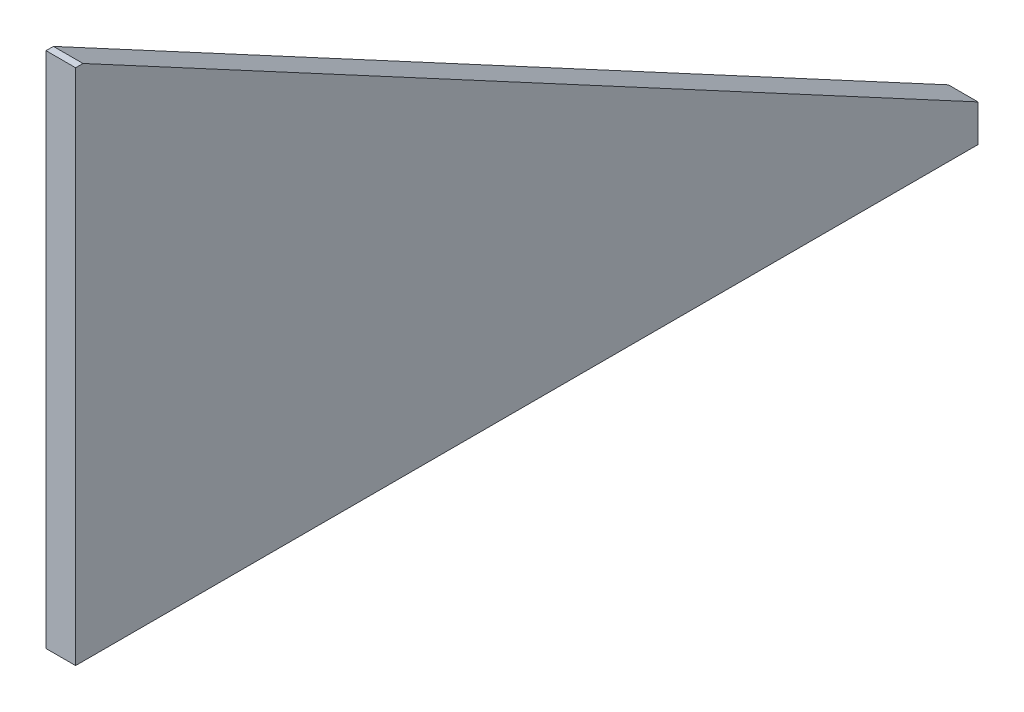
ISO-10303-21;
HEADER;
FILE_DESCRIPTION(('STEP AP214'),'2;1');
FILE_NAME('part.step','',(''),(''),'','','');
FILE_SCHEMA(('AUTOMOTIVE_DESIGN { 1 0 10303 214 1 1 1 1 }'));
ENDSEC;
DATA;
#1=APPLICATION_CONTEXT('core data for automotive mechanical design processes');
#2=APPLICATION_PROTOCOL_DEFINITION('international standard','automotive_design',2000,#1);
#3=PRODUCT_CONTEXT('',#1,'mechanical');
#4=PRODUCT('Part','Part','',(#3));
#5=PRODUCT_RELATED_PRODUCT_CATEGORY('part','',(#4));
#6=PRODUCT_DEFINITION_FORMATION('','',#4);
#7=PRODUCT_DEFINITION_CONTEXT('part definition',#1,'design');
#8=PRODUCT_DEFINITION('design','',#6,#7);
#9=PRODUCT_DEFINITION_SHAPE('','',#8);
#10=(LENGTH_UNIT() NAMED_UNIT(*) SI_UNIT(.MILLI.,.METRE.));
#11=(NAMED_UNIT(*) PLANE_ANGLE_UNIT() SI_UNIT($,.RADIAN.));
#12=(NAMED_UNIT(*) SI_UNIT($,.STERADIAN.) SOLID_ANGLE_UNIT());
#13=UNCERTAINTY_MEASURE_WITH_UNIT(LENGTH_MEASURE(1.E-05),#10,'distance_accuracy_value','');
#14=(GEOMETRIC_REPRESENTATION_CONTEXT(3) GLOBAL_UNCERTAINTY_ASSIGNED_CONTEXT((#13)) GLOBAL_UNIT_ASSIGNED_CONTEXT((#10,
#11,#12)) REPRESENTATION_CONTEXT('',''));
#15=CARTESIAN_POINT('',(0.,0.,0.));
#16=DIRECTION('',(0.,0.,1.));
#17=DIRECTION('',(1.,0.,0.));
#18=AXIS2_PLACEMENT_3D('',#15,#16,#17);
#19=CARTESIAN_POINT('',(-16.,0.,-488.));
#20=DIRECTION('',(0.,-1.,0.));
#21=DIRECTION('',(0.,0.,-1.));
#22=AXIS2_PLACEMENT_3D('',#19,#20,#21);
#23=PLANE('',#22);
#24=DIRECTION('',(0.,0.,-1.));
#25=VECTOR('',#24,1.);
#26=CARTESIAN_POINT('',(0.,0.,-488.));
#27=LINE('',#26,#25);
#28=CARTESIAN_POINT('',(0.,0.,0.));
#29=VERTEX_POINT('',#28);
#30=CARTESIAN_POINT('',(0.,0.,-488.));
#31=VERTEX_POINT('',#30);
#32=EDGE_CURVE('E113',#29,#31,#27,.T.);
#33=ORIENTED_EDGE('',*,*,#32,.F.);
#34=DIRECTION('',(1.,0.,0.));
#35=VECTOR('',#34,1.);
#36=CARTESIAN_POINT('',(-16.,0.,0.));
#37=LINE('',#36,#35);
#38=CARTESIAN_POINT('',(-16.,0.,0.));
#39=VERTEX_POINT('',#38);
#40=EDGE_CURVE('E11',#39,#29,#37,.T.);
#41=ORIENTED_EDGE('',*,*,#40,.F.);
#42=DIRECTION('',(0.,0.,-1.));
#43=VECTOR('',#42,1.);
#44=CARTESIAN_POINT('',(-16.,0.,-488.));
#45=LINE('',#44,#43);
#46=CARTESIAN_POINT('',(-16.,0.,-488.));
#47=VERTEX_POINT('',#46);
#48=EDGE_CURVE('E108',#39,#47,#45,.T.);
#49=ORIENTED_EDGE('',*,*,#48,.T.);
#50=DIRECTION('',(1.,0.,0.));
#51=VECTOR('',#50,1.);
#52=CARTESIAN_POINT('',(-16.,0.,-488.));
#53=LINE('',#52,#51);
#54=EDGE_CURVE('E39',#47,#31,#53,.T.);
#55=ORIENTED_EDGE('',*,*,#54,.T.);
#56=EDGE_LOOP('',(#33,#41,#49,#55));
#57=FACE_BOUND('',#56,.T.);
#58=ADVANCED_FACE('F36',(#57),#23,.T.);
#59=CARTESIAN_POINT('',(-16.,0.,0.));
#60=DIRECTION('',(0.,0.,1.));
#61=DIRECTION('',(1.,0.,0.));
#62=AXIS2_PLACEMENT_3D('',#59,#60,#61);
#63=PLANE('',#62);
#64=DIRECTION('',(0.,-1.,0.));
#65=VECTOR('',#64,1.);
#66=CARTESIAN_POINT('',(0.,0.,0.));
#67=LINE('',#66,#65);
#68=CARTESIAN_POINT('',(0.,280.,0.));
#69=VERTEX_POINT('',#68);
#70=EDGE_CURVE('E122',#69,#29,#67,.T.);
#71=ORIENTED_EDGE('',*,*,#70,.F.);
#72=DIRECTION('',(1.,0.,0.));
#73=VECTOR('',#72,1.);
#74=CARTESIAN_POINT('',(-16.,280.,0.));
#75=LINE('',#74,#73);
#76=CARTESIAN_POINT('',(-16.,280.,0.));
#77=VERTEX_POINT('',#76);
#78=EDGE_CURVE('E45',#77,#69,#75,.T.);
#79=ORIENTED_EDGE('',*,*,#78,.F.);
#80=DIRECTION('',(0.,-1.,0.));
#81=VECTOR('',#80,1.);
#82=CARTESIAN_POINT('',(-16.,0.,0.));
#83=LINE('',#82,#81);
#84=EDGE_CURVE('E103',#77,#39,#83,.T.);
#85=ORIENTED_EDGE('',*,*,#84,.T.);
#86=ORIENTED_EDGE('',*,*,#40,.T.);
#87=EDGE_LOOP('',(#71,#79,#85,#86));
#88=FACE_BOUND('',#87,.T.);
#89=ADVANCED_FACE('F128',(#88),#63,.T.);
#90=CARTESIAN_POINT('',(-16.,280.,0.));
#91=DIRECTION('',(0.,1.,0.));
#92=DIRECTION('',(0.,0.,1.));
#93=AXIS2_PLACEMENT_3D('',#90,#91,#92);
#94=PLANE('',#93);
#95=DIRECTION('',(0.,0.,1.));
#96=VECTOR('',#95,1.);
#97=CARTESIAN_POINT('',(0.,280.,0.));
#98=LINE('',#97,#96);
#99=CARTESIAN_POINT('',(0.,280.,-4.));
#100=VERTEX_POINT('',#99);
#101=EDGE_CURVE('E92',#100,#69,#98,.T.);
#102=ORIENTED_EDGE('',*,*,#101,.F.);
#103=DIRECTION('',(1.,0.,0.));
#104=VECTOR('',#103,1.);
#105=CARTESIAN_POINT('',(-16.,280.,-4.));
#106=LINE('',#105,#104);
#107=CARTESIAN_POINT('',(-16.,280.,-4.));
#108=VERTEX_POINT('',#107);
#109=EDGE_CURVE('E87',#108,#100,#106,.T.);
#110=ORIENTED_EDGE('',*,*,#109,.F.);
#111=DIRECTION('',(0.,0.,1.));
#112=VECTOR('',#111,1.);
#113=CARTESIAN_POINT('',(-16.,280.,0.));
#114=LINE('',#113,#112);
#115=EDGE_CURVE('E90',#108,#77,#114,.T.);
#116=ORIENTED_EDGE('',*,*,#115,.T.);
#117=ORIENTED_EDGE('',*,*,#78,.T.);
#118=EDGE_LOOP('',(#102,#110,#116,#117));
#119=FACE_BOUND('',#118,.T.);
#120=ADVANCED_FACE('F89',(#119),#94,.T.);
#121=CARTESIAN_POINT('',(-16.,280.,-4.));
#122=DIRECTION('',(0.,0.880938225598167,-0.473231278213891));
#123=DIRECTION('',(0.,0.473231278213891,0.880938225598167));
#124=AXIS2_PLACEMENT_3D('',#121,#122,#123);
#125=PLANE('',#124);
#126=DIRECTION('',(0.,0.473231278213891,0.880938225598167));
#127=VECTOR('',#126,1.);
#128=CARTESIAN_POINT('',(0.,280.,-4.));
#129=LINE('',#128,#127);
#130=CARTESIAN_POINT('',(0.,20.,-488.));
#131=VERTEX_POINT('',#130);
#132=EDGE_CURVE('E119',#131,#100,#129,.T.);
#133=ORIENTED_EDGE('',*,*,#132,.F.);
#134=DIRECTION('',(1.,0.,0.));
#135=VECTOR('',#134,1.);
#136=CARTESIAN_POINT('',(-16.,20.,-488.));
#137=LINE('',#136,#135);
#138=CARTESIAN_POINT('',(-16.,20.,-488.));
#139=VERTEX_POINT('',#138);
#140=EDGE_CURVE('E97',#139,#131,#137,.T.);
#141=ORIENTED_EDGE('',*,*,#140,.F.);
#142=DIRECTION('',(0.,0.473231278213891,0.880938225598167));
#143=VECTOR('',#142,1.);
#144=CARTESIAN_POINT('',(-16.,280.,-4.));
#145=LINE('',#144,#143);
#146=EDGE_CURVE('E102',#139,#108,#145,.T.);
#147=ORIENTED_EDGE('',*,*,#146,.T.);
#148=ORIENTED_EDGE('',*,*,#109,.T.);
#149=EDGE_LOOP('',(#133,#141,#147,#148));
#150=FACE_BOUND('',#149,.T.);
#151=ADVANCED_FACE('F105',(#150),#125,.T.);
#152=CARTESIAN_POINT('',(-16.,20.,-488.));
#153=DIRECTION('',(0.,0.,-1.));
#154=DIRECTION('',(-1.,0.,0.));
#155=AXIS2_PLACEMENT_3D('',#152,#153,#154);
#156=PLANE('',#155);
#157=DIRECTION('',(0.,1.,0.));
#158=VECTOR('',#157,1.);
#159=CARTESIAN_POINT('',(0.,20.,-488.));
#160=LINE('',#159,#158);
#161=EDGE_CURVE('E116',#31,#131,#160,.T.);
#162=ORIENTED_EDGE('',*,*,#161,.F.);
#163=ORIENTED_EDGE('',*,*,#54,.F.);
#164=DIRECTION('',(0.,1.,0.));
#165=VECTOR('',#164,1.);
#166=CARTESIAN_POINT('',(-16.,20.,-488.));
#167=LINE('',#166,#165);
#168=EDGE_CURVE('E106',#47,#139,#167,.T.);
#169=ORIENTED_EDGE('',*,*,#168,.T.);
#170=ORIENTED_EDGE('',*,*,#140,.T.);
#171=EDGE_LOOP('',(#162,#163,#169,#170));
#172=FACE_BOUND('',#171,.T.);
#173=ADVANCED_FACE('F125',(#172),#156,.T.);
#174=CARTESIAN_POINT('',(-16.,0.,0.));
#175=DIRECTION('',(-1.,0.,0.));
#176=DIRECTION('',(0.,0.,1.));
#177=AXIS2_PLACEMENT_3D('',#174,#175,#176);
#178=PLANE('',#177);
#179=ORIENTED_EDGE('',*,*,#48,.F.);
#180=ORIENTED_EDGE('',*,*,#84,.F.);
#181=ORIENTED_EDGE('',*,*,#115,.F.);
#182=ORIENTED_EDGE('',*,*,#146,.F.);
#183=ORIENTED_EDGE('',*,*,#168,.F.);
#184=EDGE_LOOP('',(#179,#180,#181,#182,#183));
#185=FACE_BOUND('',#184,.T.);
#186=ADVANCED_FACE('F101',(#185),#178,.T.);
#187=CARTESIAN_POINT('',(0.,0.,0.));
#188=DIRECTION('',(-1.,0.,0.));
#189=DIRECTION('',(0.,0.,1.));
#190=AXIS2_PLACEMENT_3D('',#187,#188,#189);
#191=PLANE('',#190);
#192=ORIENTED_EDGE('',*,*,#32,.T.);
#193=ORIENTED_EDGE('',*,*,#161,.T.);
#194=ORIENTED_EDGE('',*,*,#132,.T.);
#195=ORIENTED_EDGE('',*,*,#101,.T.);
#196=ORIENTED_EDGE('',*,*,#70,.T.);
#197=EDGE_LOOP('',(#192,#193,#194,#195,#196));
#198=FACE_BOUND('',#197,.T.);
#199=ADVANCED_FACE('F127',(#198),#191,.F.);
#200=CLOSED_SHELL('',(#58,#89,#120,#151,#173,#186,#199));
#201=MANIFOLD_SOLID_BREP('B2',#200);
#202=ADVANCED_BREP_SHAPE_REPRESENTATION('',(#18,#201),#14);
#203=SHAPE_DEFINITION_REPRESENTATION(#9,#202);
ENDSEC;
END-ISO-10303-21;
